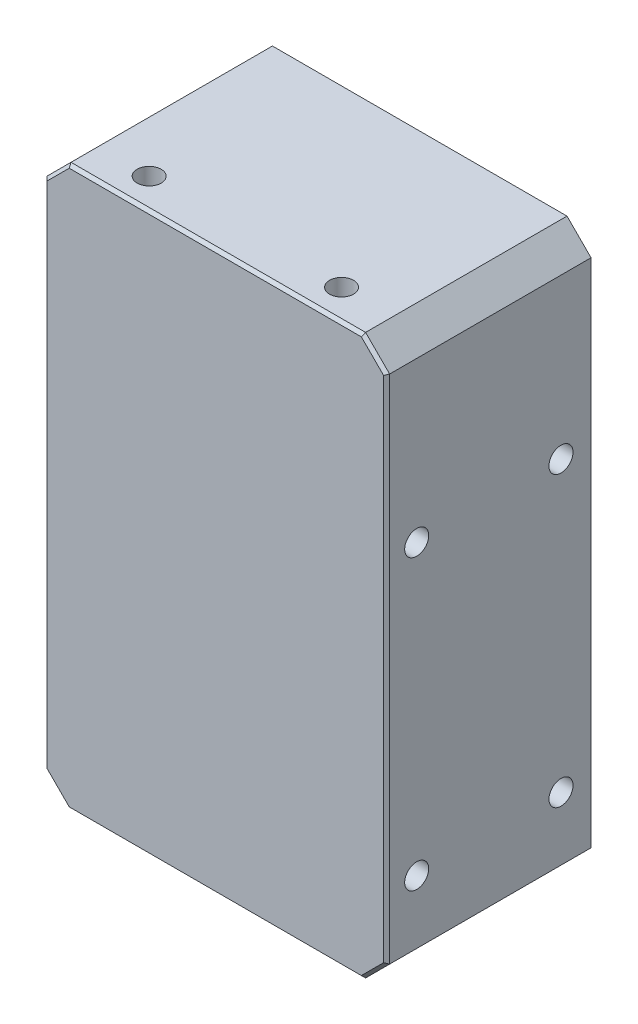
ISO-10303-21;
HEADER;
FILE_DESCRIPTION(('STEP AP214'),'2;1');
FILE_NAME('part.step','',(''),(''),'','','');
FILE_SCHEMA(('AUTOMOTIVE_DESIGN { 1 0 10303 214 1 1 1 1 }'));
ENDSEC;
DATA;
#1=APPLICATION_CONTEXT('core data for automotive mechanical design processes');
#2=APPLICATION_PROTOCOL_DEFINITION('international standard','automotive_design',2000,#1);
#3=PRODUCT_CONTEXT('',#1,'mechanical');
#4=PRODUCT('Part','Part','',(#3));
#5=PRODUCT_RELATED_PRODUCT_CATEGORY('part','',(#4));
#6=PRODUCT_DEFINITION_FORMATION('','',#4);
#7=PRODUCT_DEFINITION_CONTEXT('part definition',#1,'design');
#8=PRODUCT_DEFINITION('design','',#6,#7);
#9=PRODUCT_DEFINITION_SHAPE('','',#8);
#10=(LENGTH_UNIT() NAMED_UNIT(*) SI_UNIT(.MILLI.,.METRE.));
#11=(NAMED_UNIT(*) PLANE_ANGLE_UNIT() SI_UNIT($,.RADIAN.));
#12=(NAMED_UNIT(*) SI_UNIT($,.STERADIAN.) SOLID_ANGLE_UNIT());
#13=UNCERTAINTY_MEASURE_WITH_UNIT(LENGTH_MEASURE(1.E-05),#10,'distance_accuracy_value','');
#14=(GEOMETRIC_REPRESENTATION_CONTEXT(3) GLOBAL_UNCERTAINTY_ASSIGNED_CONTEXT((#13)) GLOBAL_UNIT_ASSIGNED_CONTEXT((#10,
#11,#12)) REPRESENTATION_CONTEXT('',''));
#15=CARTESIAN_POINT('',(0.,0.,0.));
#16=DIRECTION('',(0.,0.,1.));
#17=DIRECTION('',(1.,0.,0.));
#18=AXIS2_PLACEMENT_3D('',#15,#16,#17);
#19=CARTESIAN_POINT('',(-14.25,23.25,-8.5));
#20=DIRECTION('',(1.,0.,0.));
#21=DIRECTION('',(0.,0.,-1.));
#22=AXIS2_PLACEMENT_3D('',#19,#20,#21);
#23=PLANE('',#22);
#24=CARTESIAN_POINT('',(-14.25,-16.,6.));
#25=DIRECTION('',(1.,0.,0.));
#26=DIRECTION('',(0.,0.,-1.));
#27=AXIS2_PLACEMENT_3D('',#24,#25,#26);
#28=CIRCLE('',#27,1.);
#29=CARTESIAN_POINT('',(-14.25,-16.,5.));
#30=VERTEX_POINT('',#29);
#31=EDGE_CURVE('E311',#30,#30,#28,.T.);
#32=ORIENTED_EDGE('',*,*,#31,.T.);
#33=EDGE_LOOP('',(#32));
#34=FACE_BOUND('',#33,.T.);
#35=CARTESIAN_POINT('',(-14.25,8.,6.));
#36=DIRECTION('',(1.,0.,0.));
#37=DIRECTION('',(0.,0.,-1.));
#38=AXIS2_PLACEMENT_3D('',#35,#36,#37);
#39=CIRCLE('',#38,1.);
#40=CARTESIAN_POINT('',(-14.25,8.,5.));
#41=VERTEX_POINT('',#40);
#42=EDGE_CURVE('E327',#41,#41,#39,.T.);
#43=ORIENTED_EDGE('',*,*,#42,.T.);
#44=EDGE_LOOP('',(#43));
#45=FACE_BOUND('',#44,.T.);
#46=DIRECTION('',(0.,0.,1.));
#47=VECTOR('',#46,1.);
#48=CARTESIAN_POINT('',(-14.25,-21.25,8.5));
#49=LINE('',#48,#47);
#50=CARTESIAN_POINT('',(-14.25,-21.25,-8.5));
#51=VERTEX_POINT('',#50);
#52=CARTESIAN_POINT('',(-14.25,-21.25,8.25));
#53=VERTEX_POINT('',#52);
#54=EDGE_CURVE('E192',#51,#53,#49,.T.);
#55=ORIENTED_EDGE('',*,*,#54,.T.);
#56=DIRECTION('',(0.,1.,0.));
#57=VECTOR('',#56,1.);
#58=CARTESIAN_POINT('',(-14.25,23.25,8.25));
#59=LINE('',#58,#57);
#60=CARTESIAN_POINT('',(-14.25,21.25,8.25));
#61=VERTEX_POINT('',#60);
#62=EDGE_CURVE('E236',#53,#61,#59,.T.);
#63=ORIENTED_EDGE('',*,*,#62,.T.);
#64=DIRECTION('',(0.,0.,-1.));
#65=VECTOR('',#64,1.);
#66=CARTESIAN_POINT('',(-14.25,21.25,-8.5));
#67=LINE('',#66,#65);
#68=CARTESIAN_POINT('',(-14.25,21.25,-8.5));
#69=VERTEX_POINT('',#68);
#70=EDGE_CURVE('E189',#61,#69,#67,.T.);
#71=ORIENTED_EDGE('',*,*,#70,.T.);
#72=DIRECTION('',(0.,-1.,0.));
#73=VECTOR('',#72,1.);
#74=CARTESIAN_POINT('',(-14.25,23.25,-8.5));
#75=LINE('',#74,#73);
#76=EDGE_CURVE('E162',#69,#51,#75,.T.);
#77=ORIENTED_EDGE('',*,*,#76,.T.);
#78=EDGE_LOOP('',(#55,#63,#71,#77));
#79=FACE_BOUND('',#78,.T.);
#80=CARTESIAN_POINT('',(-14.25,8.,-6.));
#81=DIRECTION('',(1.,0.,0.));
#82=DIRECTION('',(0.,0.,-1.));
#83=AXIS2_PLACEMENT_3D('',#80,#81,#82);
#84=CIRCLE('',#83,1.);
#85=CARTESIAN_POINT('',(-14.25,8.,-7.));
#86=VERTEX_POINT('',#85);
#87=EDGE_CURVE('E319',#86,#86,#84,.T.);
#88=ORIENTED_EDGE('',*,*,#87,.T.);
#89=EDGE_LOOP('',(#88));
#90=FACE_BOUND('',#89,.T.);
#91=CARTESIAN_POINT('',(-14.25,-16.,-6.));
#92=DIRECTION('',(1.,0.,0.));
#93=DIRECTION('',(0.,0.,-1.));
#94=AXIS2_PLACEMENT_3D('',#91,#92,#93);
#95=CIRCLE('',#94,1.);
#96=CARTESIAN_POINT('',(-14.25,-16.,-7.));
#97=VERTEX_POINT('',#96);
#98=EDGE_CURVE('E303',#97,#97,#95,.T.);
#99=ORIENTED_EDGE('',*,*,#98,.T.);
#100=EDGE_LOOP('',(#99));
#101=FACE_BOUND('',#100,.T.);
#102=ADVANCED_FACE('F16',(#34,#45,#79,#90,#101),#23,.F.);
#103=CARTESIAN_POINT('',(14.25,23.25,8.5));
#104=DIRECTION('',(0.,0.,-1.));
#105=DIRECTION('',(-1.,0.,0.));
#106=AXIS2_PLACEMENT_3D('',#103,#104,#105);
#107=PLANE('',#106);
#108=DIRECTION('',(0.,1.,0.));
#109=VECTOR('',#108,1.);
#110=CARTESIAN_POINT('',(14.,23.25,8.5));
#111=LINE('',#110,#109);
#112=CARTESIAN_POINT('',(14.,-21.1464466094068,8.5));
#113=VERTEX_POINT('',#112);
#114=CARTESIAN_POINT('',(14.,21.1464466094067,8.5));
#115=VERTEX_POINT('',#114);
#116=EDGE_CURVE('E209',#113,#115,#111,.T.);
#117=ORIENTED_EDGE('',*,*,#116,.T.);
#118=DIRECTION('',(-0.707106781186546,0.707106781186549,0.));
#119=VECTOR('',#118,1.);
#120=CARTESIAN_POINT('',(12.0732233047034,23.0732233047034,8.5));
#121=LINE('',#120,#119);
#122=CARTESIAN_POINT('',(12.1464466094067,23.,8.5));
#123=VERTEX_POINT('',#122);
#124=EDGE_CURVE('E224',#115,#123,#121,.T.);
#125=ORIENTED_EDGE('',*,*,#124,.T.);
#126=DIRECTION('',(-1.,0.,0.));
#127=VECTOR('',#126,1.);
#128=CARTESIAN_POINT('',(14.25,23.,8.5));
#129=LINE('',#128,#127);
#130=CARTESIAN_POINT('',(-12.1464466094067,23.,8.5));
#131=VERTEX_POINT('',#130);
#132=EDGE_CURVE('E221',#123,#131,#129,.T.);
#133=ORIENTED_EDGE('',*,*,#132,.T.);
#134=DIRECTION('',(-0.707106781186546,-0.707106781186549,0.));
#135=VECTOR('',#134,1.);
#136=CARTESIAN_POINT('',(-14.0732233047034,21.0732233047033,8.5));
#137=LINE('',#136,#135);
#138=CARTESIAN_POINT('',(-14.,21.1464466094067,8.5));
#139=VERTEX_POINT('',#138);
#140=EDGE_CURVE('E218',#131,#139,#137,.T.);
#141=ORIENTED_EDGE('',*,*,#140,.T.);
#142=DIRECTION('',(0.,-1.,0.));
#143=VECTOR('',#142,1.);
#144=CARTESIAN_POINT('',(-14.,23.25,8.5));
#145=LINE('',#144,#143);
#146=CARTESIAN_POINT('',(-14.,-21.1464466094067,8.5));
#147=VERTEX_POINT('',#146);
#148=EDGE_CURVE('E215',#139,#147,#145,.T.);
#149=ORIENTED_EDGE('',*,*,#148,.T.);
#150=DIRECTION('',(0.707106781186549,-0.707106781186547,0.));
#151=VECTOR('',#150,1.);
#152=CARTESIAN_POINT('',(-12.0732233047034,-23.0732233047034,8.5));
#153=LINE('',#152,#151);
#154=CARTESIAN_POINT('',(-12.1464466094067,-23.,8.5));
#155=VERTEX_POINT('',#154);
#156=EDGE_CURVE('E212',#147,#155,#153,.T.);
#157=ORIENTED_EDGE('',*,*,#156,.T.);
#158=DIRECTION('',(1.,0.,0.));
#159=VECTOR('',#158,1.);
#160=CARTESIAN_POINT('',(12.25,-23.,8.5));
#161=LINE('',#160,#159);
#162=CARTESIAN_POINT('',(12.1464466094067,-23.,8.5));
#163=VERTEX_POINT('',#162);
#164=EDGE_CURVE('E203',#155,#163,#161,.T.);
#165=ORIENTED_EDGE('',*,*,#164,.T.);
#166=DIRECTION('',(0.707106781186548,0.707106781186547,0.));
#167=VECTOR('',#166,1.);
#168=CARTESIAN_POINT('',(14.0732233047034,-21.0732233047034,8.5));
#169=LINE('',#168,#167);
#170=EDGE_CURVE('E206',#163,#113,#169,.T.);
#171=ORIENTED_EDGE('',*,*,#170,.T.);
#172=EDGE_LOOP('',(#117,#125,#133,#141,#149,#157,#165,#171));
#173=FACE_BOUND('',#172,.T.);
#174=ADVANCED_FACE('F428',(#173),#107,.F.);
#175=CARTESIAN_POINT('',(14.25,23.25,-8.5));
#176=DIRECTION('',(-1.,0.,0.));
#177=DIRECTION('',(0.,0.,1.));
#178=AXIS2_PLACEMENT_3D('',#175,#176,#177);
#179=PLANE('',#178);
#180=CARTESIAN_POINT('',(14.25,-16.,-6.));
#181=DIRECTION('',(1.,0.,0.));
#182=DIRECTION('',(0.,0.,-1.));
#183=AXIS2_PLACEMENT_3D('',#180,#181,#182);
#184=CIRCLE('',#183,1.);
#185=CARTESIAN_POINT('',(14.25,-16.,-7.));
#186=VERTEX_POINT('',#185);
#187=EDGE_CURVE('E335',#186,#186,#184,.T.);
#188=ORIENTED_EDGE('',*,*,#187,.F.);
#189=EDGE_LOOP('',(#188));
#190=FACE_BOUND('',#189,.T.);
#191=CARTESIAN_POINT('',(14.25,-16.,6.));
#192=DIRECTION('',(1.,0.,0.));
#193=DIRECTION('',(0.,0.,-1.));
#194=AXIS2_PLACEMENT_3D('',#191,#192,#193);
#195=CIRCLE('',#194,1.);
#196=CARTESIAN_POINT('',(14.25,-16.,5.));
#197=VERTEX_POINT('',#196);
#198=EDGE_CURVE('E343',#197,#197,#195,.T.);
#199=ORIENTED_EDGE('',*,*,#198,.F.);
#200=EDGE_LOOP('',(#199));
#201=FACE_BOUND('',#200,.T.);
#202=CARTESIAN_POINT('',(14.25,8.,-6.));
#203=DIRECTION('',(1.,0.,0.));
#204=DIRECTION('',(0.,0.,-1.));
#205=AXIS2_PLACEMENT_3D('',#202,#203,#204);
#206=CIRCLE('',#205,1.);
#207=CARTESIAN_POINT('',(14.25,8.,-7.));
#208=VERTEX_POINT('',#207);
#209=EDGE_CURVE('E351',#208,#208,#206,.T.);
#210=ORIENTED_EDGE('',*,*,#209,.F.);
#211=EDGE_LOOP('',(#210));
#212=FACE_BOUND('',#211,.T.);
#213=CARTESIAN_POINT('',(14.25,8.,6.));
#214=DIRECTION('',(1.,0.,0.));
#215=DIRECTION('',(0.,0.,-1.));
#216=AXIS2_PLACEMENT_3D('',#213,#214,#215);
#217=CIRCLE('',#216,1.);
#218=CARTESIAN_POINT('',(14.25,8.,5.));
#219=VERTEX_POINT('',#218);
#220=EDGE_CURVE('E359',#219,#219,#217,.T.);
#221=ORIENTED_EDGE('',*,*,#220,.F.);
#222=EDGE_LOOP('',(#221));
#223=FACE_BOUND('',#222,.T.);
#224=DIRECTION('',(0.,0.,1.));
#225=VECTOR('',#224,1.);
#226=CARTESIAN_POINT('',(14.25,21.25,-8.5));
#227=LINE('',#226,#225);
#228=CARTESIAN_POINT('',(14.25,21.25,-8.5));
#229=VERTEX_POINT('',#228);
#230=CARTESIAN_POINT('',(14.25,21.25,8.25));
#231=VERTEX_POINT('',#230);
#232=EDGE_CURVE('E160',#229,#231,#227,.T.);
#233=ORIENTED_EDGE('',*,*,#232,.T.);
#234=DIRECTION('',(0.,-1.,0.));
#235=VECTOR('',#234,1.);
#236=CARTESIAN_POINT('',(14.25,23.25,8.25));
#237=LINE('',#236,#235);
#238=CARTESIAN_POINT('',(14.25,-21.25,8.25));
#239=VERTEX_POINT('',#238);
#240=EDGE_CURVE('E52',#231,#239,#237,.T.);
#241=ORIENTED_EDGE('',*,*,#240,.T.);
#242=DIRECTION('',(0.,0.,-1.));
#243=VECTOR('',#242,1.);
#244=CARTESIAN_POINT('',(14.25,-21.25,-8.5));
#245=LINE('',#244,#243);
#246=CARTESIAN_POINT('',(14.25,-21.25,-8.5));
#247=VERTEX_POINT('',#246);
#248=EDGE_CURVE('E157',#239,#247,#245,.T.);
#249=ORIENTED_EDGE('',*,*,#248,.T.);
#250=DIRECTION('',(0.,-1.,0.));
#251=VECTOR('',#250,1.);
#252=CARTESIAN_POINT('',(14.25,23.25,-8.5));
#253=LINE('',#252,#251);
#254=EDGE_CURVE('E149',#229,#247,#253,.T.);
#255=ORIENTED_EDGE('',*,*,#254,.F.);
#256=EDGE_LOOP('',(#233,#241,#249,#255));
#257=FACE_BOUND('',#256,.T.);
#258=ADVANCED_FACE('F159',(#190,#201,#212,#223,#257),#179,.F.);
#259=CARTESIAN_POINT('',(14.25,23.25,-8.5));
#260=DIRECTION('',(0.,0.,1.));
#261=DIRECTION('',(1.,0.,0.));
#262=AXIS2_PLACEMENT_3D('',#259,#260,#261);
#263=PLANE('',#262);
#264=ORIENTED_EDGE('',*,*,#254,.T.);
#265=DIRECTION('',(-0.707106781186548,-0.707106781186547,0.));
#266=VECTOR('',#265,1.);
#267=CARTESIAN_POINT('',(14.25,-21.25,-8.5));
#268=LINE('',#267,#266);
#269=CARTESIAN_POINT('',(12.25,-23.25,-8.5));
#270=VERTEX_POINT('',#269);
#271=EDGE_CURVE('E180',#247,#270,#268,.T.);
#272=ORIENTED_EDGE('',*,*,#271,.T.);
#273=DIRECTION('',(-1.,0.,0.));
#274=VECTOR('',#273,1.);
#275=CARTESIAN_POINT('',(14.25,-23.25,-8.5));
#276=LINE('',#275,#274);
#277=CARTESIAN_POINT('',(-12.25,-23.25,-8.5));
#278=VERTEX_POINT('',#277);
#279=EDGE_CURVE('E383',#270,#278,#276,.T.);
#280=ORIENTED_EDGE('',*,*,#279,.T.);
#281=DIRECTION('',(-0.707106781186549,0.707106781186547,0.));
#282=VECTOR('',#281,1.);
#283=CARTESIAN_POINT('',(-14.25,-21.25,-8.5));
#284=LINE('',#283,#282);
#285=EDGE_CURVE('E177',#278,#51,#284,.T.);
#286=ORIENTED_EDGE('',*,*,#285,.T.);
#287=ORIENTED_EDGE('',*,*,#76,.F.);
#288=DIRECTION('',(-0.707106781186546,-0.707106781186549,0.));
#289=VECTOR('',#288,1.);
#290=CARTESIAN_POINT('',(-12.25,23.25,-8.5));
#291=LINE('',#290,#289);
#292=CARTESIAN_POINT('',(-12.25,23.25,-8.5));
#293=VERTEX_POINT('',#292);
#294=EDGE_CURVE('E156',#69,#293,#291,.F.);
#295=ORIENTED_EDGE('',*,*,#294,.T.);
#296=DIRECTION('',(-1.,0.,0.));
#297=VECTOR('',#296,1.);
#298=CARTESIAN_POINT('',(14.25,23.25,-8.5));
#299=LINE('',#298,#297);
#300=CARTESIAN_POINT('',(12.25,23.25,-8.5));
#301=VERTEX_POINT('',#300);
#302=EDGE_CURVE('E151',#301,#293,#299,.T.);
#303=ORIENTED_EDGE('',*,*,#302,.F.);
#304=DIRECTION('',(-0.707106781186546,0.707106781186549,0.));
#305=VECTOR('',#304,1.);
#306=CARTESIAN_POINT('',(12.25,23.25,-8.5));
#307=LINE('',#306,#305);
#308=EDGE_CURVE('E146',#301,#229,#307,.F.);
#309=ORIENTED_EDGE('',*,*,#308,.T.);
#310=EDGE_LOOP('',(#264,#272,#280,#286,#287,#295,#303,#309));
#311=FACE_BOUND('',#310,.T.);
#312=ADVANCED_FACE('F148',(#311),#263,.F.);
#313=CARTESIAN_POINT('',(-14.25,23.25,8.5));
#314=DIRECTION('',(0.,-1.,0.));
#315=DIRECTION('',(0.,0.,-1.));
#316=AXIS2_PLACEMENT_3D('',#313,#314,#315);
#317=PLANE('',#316);
#318=CARTESIAN_POINT('',(-8.,23.25,6.));
#319=DIRECTION('',(0.,1.,0.));
#320=DIRECTION('',(0.,0.,1.));
#321=AXIS2_PLACEMENT_3D('',#318,#319,#320);
#322=CIRCLE('',#321,1.);
#323=CARTESIAN_POINT('',(-8.,23.25,7.));
#324=VERTEX_POINT('',#323);
#325=EDGE_CURVE('E367',#324,#324,#322,.T.);
#326=ORIENTED_EDGE('',*,*,#325,.F.);
#327=EDGE_LOOP('',(#326));
#328=FACE_BOUND('',#327,.T.);
#329=CARTESIAN_POINT('',(8.,23.25,6.));
#330=DIRECTION('',(0.,1.,0.));
#331=DIRECTION('',(0.,0.,1.));
#332=AXIS2_PLACEMENT_3D('',#329,#330,#331);
#333=CIRCLE('',#332,1.);
#334=CARTESIAN_POINT('',(8.,23.25,7.));
#335=VERTEX_POINT('',#334);
#336=EDGE_CURVE('E375',#335,#335,#333,.T.);
#337=ORIENTED_EDGE('',*,*,#336,.F.);
#338=EDGE_LOOP('',(#337));
#339=FACE_BOUND('',#338,.T.);
#340=DIRECTION('',(0.,0.,1.));
#341=VECTOR('',#340,1.);
#342=CARTESIAN_POINT('',(-12.25,23.25,8.5));
#343=LINE('',#342,#341);
#344=CARTESIAN_POINT('',(-12.25,23.25,8.25));
#345=VERTEX_POINT('',#344);
#346=EDGE_CURVE('E199',#293,#345,#343,.T.);
#347=ORIENTED_EDGE('',*,*,#346,.T.);
#348=DIRECTION('',(1.,0.,0.));
#349=VECTOR('',#348,1.);
#350=CARTESIAN_POINT('',(-14.25,23.25,8.25));
#351=LINE('',#350,#349);
#352=CARTESIAN_POINT('',(12.25,23.25,8.25));
#353=VERTEX_POINT('',#352);
#354=EDGE_CURVE('E230',#345,#353,#351,.T.);
#355=ORIENTED_EDGE('',*,*,#354,.T.);
#356=DIRECTION('',(0.,0.,-1.));
#357=VECTOR('',#356,1.);
#358=CARTESIAN_POINT('',(12.25,23.25,8.5));
#359=LINE('',#358,#357);
#360=EDGE_CURVE('E196',#353,#301,#359,.T.);
#361=ORIENTED_EDGE('',*,*,#360,.T.);
#362=ORIENTED_EDGE('',*,*,#302,.T.);
#363=EDGE_LOOP('',(#347,#355,#361,#362));
#364=FACE_BOUND('',#363,.T.);
#365=ADVANCED_FACE('F415',(#328,#339,#364),#317,.F.);
#366=CARTESIAN_POINT('',(-14.25,-23.25,8.5));
#367=DIRECTION('',(0.,-1.,0.));
#368=DIRECTION('',(0.,0.,-1.));
#369=AXIS2_PLACEMENT_3D('',#366,#367,#368);
#370=PLANE('',#369);
#371=CARTESIAN_POINT('',(8.,-23.25,-6.));
#372=DIRECTION('',(0.,-1.,0.));
#373=DIRECTION('',(0.,0.,-1.));
#374=AXIS2_PLACEMENT_3D('',#371,#372,#373);
#375=CIRCLE('',#374,1.);
#376=CARTESIAN_POINT('',(8.,-23.25,-7.));
#377=VERTEX_POINT('',#376);
#378=EDGE_CURVE('E585',#377,#377,#375,.T.);
#379=ORIENTED_EDGE('',*,*,#378,.F.);
#380=EDGE_LOOP('',(#379));
#381=FACE_BOUND('',#380,.T.);
#382=CARTESIAN_POINT('',(-8.,-23.25,-6.));
#383=DIRECTION('',(0.,-1.,0.));
#384=DIRECTION('',(0.,0.,-1.));
#385=AXIS2_PLACEMENT_3D('',#382,#383,#384);
#386=CIRCLE('',#385,1.);
#387=CARTESIAN_POINT('',(-8.,-23.25,-7.));
#388=VERTEX_POINT('',#387);
#389=EDGE_CURVE('E596',#388,#388,#386,.T.);
#390=ORIENTED_EDGE('',*,*,#389,.F.);
#391=EDGE_LOOP('',(#390));
#392=FACE_BOUND('',#391,.T.);
#393=CARTESIAN_POINT('',(-8.,-23.25,6.));
#394=DIRECTION('',(0.,-1.,0.));
#395=DIRECTION('',(0.,0.,-1.));
#396=AXIS2_PLACEMENT_3D('',#393,#394,#395);
#397=CIRCLE('',#396,1.);
#398=CARTESIAN_POINT('',(-8.,-23.25,5.));
#399=VERTEX_POINT('',#398);
#400=EDGE_CURVE('E276',#399,#399,#397,.T.);
#401=ORIENTED_EDGE('',*,*,#400,.F.);
#402=EDGE_LOOP('',(#401));
#403=FACE_BOUND('',#402,.T.);
#404=CARTESIAN_POINT('',(8.,-23.25,6.));
#405=DIRECTION('',(0.,-1.,0.));
#406=DIRECTION('',(0.,0.,-1.));
#407=AXIS2_PLACEMENT_3D('',#404,#405,#406);
#408=CIRCLE('',#407,1.);
#409=CARTESIAN_POINT('',(8.,-23.25,5.));
#410=VERTEX_POINT('',#409);
#411=EDGE_CURVE('E295',#410,#410,#408,.T.);
#412=ORIENTED_EDGE('',*,*,#411,.F.);
#413=EDGE_LOOP('',(#412));
#414=FACE_BOUND('',#413,.T.);
#415=DIRECTION('',(0.,0.,1.));
#416=VECTOR('',#415,1.);
#417=CARTESIAN_POINT('',(12.25,-23.25,8.5));
#418=LINE('',#417,#416);
#419=CARTESIAN_POINT('',(12.25,-23.25,8.25));
#420=VERTEX_POINT('',#419);
#421=EDGE_CURVE('E186',#270,#420,#418,.T.);
#422=ORIENTED_EDGE('',*,*,#421,.T.);
#423=DIRECTION('',(-1.,0.,0.));
#424=VECTOR('',#423,1.);
#425=CARTESIAN_POINT('',(-12.25,-23.25,8.25));
#426=LINE('',#425,#424);
#427=CARTESIAN_POINT('',(-12.25,-23.25,8.25));
#428=VERTEX_POINT('',#427);
#429=EDGE_CURVE('E11',#420,#428,#426,.T.);
#430=ORIENTED_EDGE('',*,*,#429,.T.);
#431=DIRECTION('',(0.,0.,-1.));
#432=VECTOR('',#431,1.);
#433=CARTESIAN_POINT('',(-12.25,-23.25,-8.5));
#434=LINE('',#433,#432);
#435=EDGE_CURVE('E183',#428,#278,#434,.T.);
#436=ORIENTED_EDGE('',*,*,#435,.T.);
#437=ORIENTED_EDGE('',*,*,#279,.F.);
#438=EDGE_LOOP('',(#422,#430,#436,#437));
#439=FACE_BOUND('',#438,.T.);
#440=ADVANCED_FACE('F439',(#381,#392,#403,#414,#439),#370,.T.);
#441=CARTESIAN_POINT('',(8.,20.25,6.));
#442=DIRECTION('',(0.,1.,0.));
#443=DIRECTION('',(0.,0.,1.));
#444=AXIS2_PLACEMENT_3D('',#441,#442,#443);
#445=CYLINDRICAL_SURFACE('',#444,1.);
#446=CARTESIAN_POINT('',(8.,20.25,6.));
#447=DIRECTION('',(0.,1.,0.));
#448=DIRECTION('',(0.,0.,1.));
#449=AXIS2_PLACEMENT_3D('',#446,#447,#448);
#450=CIRCLE('',#449,1.);
#451=CARTESIAN_POINT('',(8.,20.25,7.));
#452=VERTEX_POINT('',#451);
#453=EDGE_CURVE('E379',#452,#452,#450,.T.);
#454=ORIENTED_EDGE('',*,*,#453,.F.);
#455=EDGE_LOOP('',(#454));
#456=FACE_BOUND('',#455,.T.);
#457=ORIENTED_EDGE('',*,*,#336,.T.);
#458=EDGE_LOOP('',(#457));
#459=FACE_BOUND('',#458,.T.);
#460=ADVANCED_FACE('F470',(#456,#459),#445,.F.);
#461=CARTESIAN_POINT('',(8.,20.25,6.));
#462=DIRECTION('',(0.,1.,0.));
#463=DIRECTION('',(0.,0.,1.));
#464=AXIS2_PLACEMENT_3D('',#461,#462,#463);
#465=PLANE('',#464);
#466=ORIENTED_EDGE('',*,*,#453,.T.);
#467=EDGE_LOOP('',(#466));
#468=FACE_BOUND('',#467,.T.);
#469=ADVANCED_FACE('F477',(#468),#465,.T.);
#470=CARTESIAN_POINT('',(-8.,20.25,6.));
#471=DIRECTION('',(0.,1.,0.));
#472=DIRECTION('',(0.,0.,1.));
#473=AXIS2_PLACEMENT_3D('',#470,#471,#472);
#474=CYLINDRICAL_SURFACE('',#473,1.);
#475=CARTESIAN_POINT('',(-8.,20.25,6.));
#476=DIRECTION('',(0.,1.,0.));
#477=DIRECTION('',(0.,0.,1.));
#478=AXIS2_PLACEMENT_3D('',#475,#476,#477);
#479=CIRCLE('',#478,1.);
#480=CARTESIAN_POINT('',(-8.,20.25,7.));
#481=VERTEX_POINT('',#480);
#482=EDGE_CURVE('E371',#481,#481,#479,.T.);
#483=ORIENTED_EDGE('',*,*,#482,.F.);
#484=EDGE_LOOP('',(#483));
#485=FACE_BOUND('',#484,.T.);
#486=ORIENTED_EDGE('',*,*,#325,.T.);
#487=EDGE_LOOP('',(#486));
#488=FACE_BOUND('',#487,.T.);
#489=ADVANCED_FACE('F481',(#485,#488),#474,.F.);
#490=CARTESIAN_POINT('',(-8.,20.25,6.));
#491=DIRECTION('',(0.,1.,0.));
#492=DIRECTION('',(0.,0.,1.));
#493=AXIS2_PLACEMENT_3D('',#490,#491,#492);
#494=PLANE('',#493);
#495=ORIENTED_EDGE('',*,*,#482,.T.);
#496=EDGE_LOOP('',(#495));
#497=FACE_BOUND('',#496,.T.);
#498=ADVANCED_FACE('F485',(#497),#494,.T.);
#499=CARTESIAN_POINT('',(11.25,8.,6.));
#500=DIRECTION('',(1.,0.,0.));
#501=DIRECTION('',(0.,0.,-1.));
#502=AXIS2_PLACEMENT_3D('',#499,#500,#501);
#503=CYLINDRICAL_SURFACE('',#502,1.);
#504=CARTESIAN_POINT('',(11.25,8.,6.));
#505=DIRECTION('',(1.,0.,0.));
#506=DIRECTION('',(0.,0.,-1.));
#507=AXIS2_PLACEMENT_3D('',#504,#505,#506);
#508=CIRCLE('',#507,1.);
#509=CARTESIAN_POINT('',(11.25,8.,5.));
#510=VERTEX_POINT('',#509);
#511=EDGE_CURVE('E363',#510,#510,#508,.T.);
#512=ORIENTED_EDGE('',*,*,#511,.F.);
#513=EDGE_LOOP('',(#512));
#514=FACE_BOUND('',#513,.T.);
#515=ORIENTED_EDGE('',*,*,#220,.T.);
#516=EDGE_LOOP('',(#515));
#517=FACE_BOUND('',#516,.T.);
#518=ADVANCED_FACE('F489',(#514,#517),#503,.F.);
#519=CARTESIAN_POINT('',(11.25,8.,6.));
#520=DIRECTION('',(1.,0.,0.));
#521=DIRECTION('',(0.,0.,-1.));
#522=AXIS2_PLACEMENT_3D('',#519,#520,#521);
#523=PLANE('',#522);
#524=ORIENTED_EDGE('',*,*,#511,.T.);
#525=EDGE_LOOP('',(#524));
#526=FACE_BOUND('',#525,.T.);
#527=ADVANCED_FACE('F493',(#526),#523,.T.);
#528=CARTESIAN_POINT('',(11.25,8.,-6.));
#529=DIRECTION('',(1.,0.,0.));
#530=DIRECTION('',(0.,0.,-1.));
#531=AXIS2_PLACEMENT_3D('',#528,#529,#530);
#532=CYLINDRICAL_SURFACE('',#531,1.);
#533=CARTESIAN_POINT('',(11.25,8.,-6.));
#534=DIRECTION('',(1.,0.,0.));
#535=DIRECTION('',(0.,0.,-1.));
#536=AXIS2_PLACEMENT_3D('',#533,#534,#535);
#537=CIRCLE('',#536,1.);
#538=CARTESIAN_POINT('',(11.25,8.,-7.));
#539=VERTEX_POINT('',#538);
#540=EDGE_CURVE('E355',#539,#539,#537,.T.);
#541=ORIENTED_EDGE('',*,*,#540,.F.);
#542=EDGE_LOOP('',(#541));
#543=FACE_BOUND('',#542,.T.);
#544=ORIENTED_EDGE('',*,*,#209,.T.);
#545=EDGE_LOOP('',(#544));
#546=FACE_BOUND('',#545,.T.);
#547=ADVANCED_FACE('F497',(#543,#546),#532,.F.);
#548=CARTESIAN_POINT('',(11.25,8.,-6.));
#549=DIRECTION('',(1.,0.,0.));
#550=DIRECTION('',(0.,0.,-1.));
#551=AXIS2_PLACEMENT_3D('',#548,#549,#550);
#552=PLANE('',#551);
#553=ORIENTED_EDGE('',*,*,#540,.T.);
#554=EDGE_LOOP('',(#553));
#555=FACE_BOUND('',#554,.T.);
#556=ADVANCED_FACE('F501',(#555),#552,.T.);
#557=CARTESIAN_POINT('',(11.25,-16.,6.));
#558=DIRECTION('',(1.,0.,0.));
#559=DIRECTION('',(0.,0.,-1.));
#560=AXIS2_PLACEMENT_3D('',#557,#558,#559);
#561=CYLINDRICAL_SURFACE('',#560,1.);
#562=CARTESIAN_POINT('',(11.25,-16.,6.));
#563=DIRECTION('',(1.,0.,0.));
#564=DIRECTION('',(0.,0.,-1.));
#565=AXIS2_PLACEMENT_3D('',#562,#563,#564);
#566=CIRCLE('',#565,1.);
#567=CARTESIAN_POINT('',(11.25,-16.,5.));
#568=VERTEX_POINT('',#567);
#569=EDGE_CURVE('E347',#568,#568,#566,.T.);
#570=ORIENTED_EDGE('',*,*,#569,.F.);
#571=EDGE_LOOP('',(#570));
#572=FACE_BOUND('',#571,.T.);
#573=ORIENTED_EDGE('',*,*,#198,.T.);
#574=EDGE_LOOP('',(#573));
#575=FACE_BOUND('',#574,.T.);
#576=ADVANCED_FACE('F505',(#572,#575),#561,.F.);
#577=CARTESIAN_POINT('',(11.25,-16.,6.));
#578=DIRECTION('',(1.,0.,0.));
#579=DIRECTION('',(0.,0.,-1.));
#580=AXIS2_PLACEMENT_3D('',#577,#578,#579);
#581=PLANE('',#580);
#582=ORIENTED_EDGE('',*,*,#569,.T.);
#583=EDGE_LOOP('',(#582));
#584=FACE_BOUND('',#583,.T.);
#585=ADVANCED_FACE('F509',(#584),#581,.T.);
#586=CARTESIAN_POINT('',(11.25,-16.,-6.));
#587=DIRECTION('',(1.,0.,0.));
#588=DIRECTION('',(0.,0.,-1.));
#589=AXIS2_PLACEMENT_3D('',#586,#587,#588);
#590=CYLINDRICAL_SURFACE('',#589,1.);
#591=CARTESIAN_POINT('',(11.25,-16.,-6.));
#592=DIRECTION('',(1.,0.,0.));
#593=DIRECTION('',(0.,0.,-1.));
#594=AXIS2_PLACEMENT_3D('',#591,#592,#593);
#595=CIRCLE('',#594,1.);
#596=CARTESIAN_POINT('',(11.25,-16.,-7.));
#597=VERTEX_POINT('',#596);
#598=EDGE_CURVE('E339',#597,#597,#595,.T.);
#599=ORIENTED_EDGE('',*,*,#598,.F.);
#600=EDGE_LOOP('',(#599));
#601=FACE_BOUND('',#600,.T.);
#602=ORIENTED_EDGE('',*,*,#187,.T.);
#603=EDGE_LOOP('',(#602));
#604=FACE_BOUND('',#603,.T.);
#605=ADVANCED_FACE('F513',(#601,#604),#590,.F.);
#606=CARTESIAN_POINT('',(11.25,-16.,-6.));
#607=DIRECTION('',(1.,0.,0.));
#608=DIRECTION('',(0.,0.,-1.));
#609=AXIS2_PLACEMENT_3D('',#606,#607,#608);
#610=PLANE('',#609);
#611=ORIENTED_EDGE('',*,*,#598,.T.);
#612=EDGE_LOOP('',(#611));
#613=FACE_BOUND('',#612,.T.);
#614=ADVANCED_FACE('F517',(#613),#610,.T.);
#615=CARTESIAN_POINT('',(-11.25,8.,6.));
#616=DIRECTION('',(-1.,0.,0.));
#617=DIRECTION('',(0.,0.,1.));
#618=AXIS2_PLACEMENT_3D('',#615,#616,#617);
#619=CYLINDRICAL_SURFACE('',#618,1.);
#620=CARTESIAN_POINT('',(-11.25,8.,6.));
#621=DIRECTION('',(1.,0.,0.));
#622=DIRECTION('',(0.,0.,-1.));
#623=AXIS2_PLACEMENT_3D('',#620,#621,#622);
#624=CIRCLE('',#623,1.);
#625=CARTESIAN_POINT('',(-11.25,8.,5.));
#626=VERTEX_POINT('',#625);
#627=EDGE_CURVE('E331',#626,#626,#624,.T.);
#628=ORIENTED_EDGE('',*,*,#627,.T.);
#629=EDGE_LOOP('',(#628));
#630=FACE_BOUND('',#629,.T.);
#631=ORIENTED_EDGE('',*,*,#42,.F.);
#632=EDGE_LOOP('',(#631));
#633=FACE_BOUND('',#632,.T.);
#634=ADVANCED_FACE('F521',(#630,#633),#619,.F.);
#635=CARTESIAN_POINT('',(-11.25,8.,6.));
#636=DIRECTION('',(-1.,0.,0.));
#637=DIRECTION('',(0.,0.,-1.));
#638=AXIS2_PLACEMENT_3D('',#635,#636,#637);
#639=PLANE('',#638);
#640=ORIENTED_EDGE('',*,*,#627,.F.);
#641=EDGE_LOOP('',(#640));
#642=FACE_BOUND('',#641,.T.);
#643=ADVANCED_FACE('F525',(#642),#639,.T.);
#644=CARTESIAN_POINT('',(-11.25,8.,-6.));
#645=DIRECTION('',(-1.,0.,0.));
#646=DIRECTION('',(0.,0.,1.));
#647=AXIS2_PLACEMENT_3D('',#644,#645,#646);
#648=CYLINDRICAL_SURFACE('',#647,1.);
#649=CARTESIAN_POINT('',(-11.25,8.,-6.));
#650=DIRECTION('',(1.,0.,0.));
#651=DIRECTION('',(0.,0.,-1.));
#652=AXIS2_PLACEMENT_3D('',#649,#650,#651);
#653=CIRCLE('',#652,1.);
#654=CARTESIAN_POINT('',(-11.25,8.,-7.));
#655=VERTEX_POINT('',#654);
#656=EDGE_CURVE('E323',#655,#655,#653,.T.);
#657=ORIENTED_EDGE('',*,*,#656,.T.);
#658=EDGE_LOOP('',(#657));
#659=FACE_BOUND('',#658,.T.);
#660=ORIENTED_EDGE('',*,*,#87,.F.);
#661=EDGE_LOOP('',(#660));
#662=FACE_BOUND('',#661,.T.);
#663=ADVANCED_FACE('F529',(#659,#662),#648,.F.);
#664=CARTESIAN_POINT('',(-11.25,8.,-6.));
#665=DIRECTION('',(-1.,0.,0.));
#666=DIRECTION('',(0.,0.,-1.));
#667=AXIS2_PLACEMENT_3D('',#664,#665,#666);
#668=PLANE('',#667);
#669=ORIENTED_EDGE('',*,*,#656,.F.);
#670=EDGE_LOOP('',(#669));
#671=FACE_BOUND('',#670,.T.);
#672=ADVANCED_FACE('F533',(#671),#668,.T.);
#673=CARTESIAN_POINT('',(-11.25,-16.,6.));
#674=DIRECTION('',(-1.,0.,0.));
#675=DIRECTION('',(0.,0.,1.));
#676=AXIS2_PLACEMENT_3D('',#673,#674,#675);
#677=CYLINDRICAL_SURFACE('',#676,1.);
#678=CARTESIAN_POINT('',(-11.25,-16.,6.));
#679=DIRECTION('',(1.,0.,0.));
#680=DIRECTION('',(0.,0.,-1.));
#681=AXIS2_PLACEMENT_3D('',#678,#679,#680);
#682=CIRCLE('',#681,1.);
#683=CARTESIAN_POINT('',(-11.25,-16.,5.));
#684=VERTEX_POINT('',#683);
#685=EDGE_CURVE('E315',#684,#684,#682,.T.);
#686=ORIENTED_EDGE('',*,*,#685,.T.);
#687=EDGE_LOOP('',(#686));
#688=FACE_BOUND('',#687,.T.);
#689=ORIENTED_EDGE('',*,*,#31,.F.);
#690=EDGE_LOOP('',(#689));
#691=FACE_BOUND('',#690,.T.);
#692=ADVANCED_FACE('F537',(#688,#691),#677,.F.);
#693=CARTESIAN_POINT('',(-11.25,-16.,6.));
#694=DIRECTION('',(-1.,0.,0.));
#695=DIRECTION('',(0.,0.,-1.));
#696=AXIS2_PLACEMENT_3D('',#693,#694,#695);
#697=PLANE('',#696);
#698=ORIENTED_EDGE('',*,*,#685,.F.);
#699=EDGE_LOOP('',(#698));
#700=FACE_BOUND('',#699,.T.);
#701=ADVANCED_FACE('F541',(#700),#697,.T.);
#702=CARTESIAN_POINT('',(-11.25,-16.,-6.));
#703=DIRECTION('',(-1.,0.,0.));
#704=DIRECTION('',(0.,0.,1.));
#705=AXIS2_PLACEMENT_3D('',#702,#703,#704);
#706=CYLINDRICAL_SURFACE('',#705,1.);
#707=CARTESIAN_POINT('',(-11.25,-16.,-6.));
#708=DIRECTION('',(1.,0.,0.));
#709=DIRECTION('',(0.,0.,-1.));
#710=AXIS2_PLACEMENT_3D('',#707,#708,#709);
#711=CIRCLE('',#710,1.);
#712=CARTESIAN_POINT('',(-11.25,-16.,-7.));
#713=VERTEX_POINT('',#712);
#714=EDGE_CURVE('E307',#713,#713,#711,.T.);
#715=ORIENTED_EDGE('',*,*,#714,.T.);
#716=EDGE_LOOP('',(#715));
#717=FACE_BOUND('',#716,.T.);
#718=ORIENTED_EDGE('',*,*,#98,.F.);
#719=EDGE_LOOP('',(#718));
#720=FACE_BOUND('',#719,.T.);
#721=ADVANCED_FACE('F545',(#717,#720),#706,.F.);
#722=CARTESIAN_POINT('',(-11.25,-16.,-6.));
#723=DIRECTION('',(-1.,0.,0.));
#724=DIRECTION('',(0.,0.,-1.));
#725=AXIS2_PLACEMENT_3D('',#722,#723,#724);
#726=PLANE('',#725);
#727=ORIENTED_EDGE('',*,*,#714,.F.);
#728=EDGE_LOOP('',(#727));
#729=FACE_BOUND('',#728,.T.);
#730=ADVANCED_FACE('F549',(#729),#726,.T.);
#731=CARTESIAN_POINT('',(8.,-20.25,6.));
#732=DIRECTION('',(0.,-1.,0.));
#733=DIRECTION('',(0.,0.,-1.));
#734=AXIS2_PLACEMENT_3D('',#731,#732,#733);
#735=CYLINDRICAL_SURFACE('',#734,1.);
#736=CARTESIAN_POINT('',(8.,-20.25,6.));
#737=DIRECTION('',(0.,-1.,0.));
#738=DIRECTION('',(0.,0.,-1.));
#739=AXIS2_PLACEMENT_3D('',#736,#737,#738);
#740=CIRCLE('',#739,1.);
#741=CARTESIAN_POINT('',(8.,-20.25,5.));
#742=VERTEX_POINT('',#741);
#743=EDGE_CURVE('E299',#742,#742,#740,.T.);
#744=ORIENTED_EDGE('',*,*,#743,.F.);
#745=EDGE_LOOP('',(#744));
#746=FACE_BOUND('',#745,.T.);
#747=ORIENTED_EDGE('',*,*,#411,.T.);
#748=EDGE_LOOP('',(#747));
#749=FACE_BOUND('',#748,.T.);
#750=ADVANCED_FACE('F553',(#746,#749),#735,.F.);
#751=CARTESIAN_POINT('',(8.,-20.25,6.));
#752=DIRECTION('',(0.,-1.,0.));
#753=DIRECTION('',(0.,0.,-1.));
#754=AXIS2_PLACEMENT_3D('',#751,#752,#753);
#755=PLANE('',#754);
#756=ORIENTED_EDGE('',*,*,#743,.T.);
#757=EDGE_LOOP('',(#756));
#758=FACE_BOUND('',#757,.T.);
#759=ADVANCED_FACE('F557',(#758),#755,.T.);
#760=CARTESIAN_POINT('',(-8.,-20.25,6.));
#761=DIRECTION('',(0.,-1.,0.));
#762=DIRECTION('',(0.,0.,-1.));
#763=AXIS2_PLACEMENT_3D('',#760,#761,#762);
#764=CYLINDRICAL_SURFACE('',#763,1.);
#765=CARTESIAN_POINT('',(-8.,-20.25,6.));
#766=DIRECTION('',(0.,-1.,0.));
#767=DIRECTION('',(0.,0.,-1.));
#768=AXIS2_PLACEMENT_3D('',#765,#766,#767);
#769=CIRCLE('',#768,1.);
#770=CARTESIAN_POINT('',(-8.,-20.25,5.));
#771=VERTEX_POINT('',#770);
#772=EDGE_CURVE('E286',#771,#771,#769,.T.);
#773=ORIENTED_EDGE('',*,*,#772,.F.);
#774=EDGE_LOOP('',(#773));
#775=FACE_BOUND('',#774,.T.);
#776=ORIENTED_EDGE('',*,*,#400,.T.);
#777=EDGE_LOOP('',(#776));
#778=FACE_BOUND('',#777,.T.);
#779=ADVANCED_FACE('F451',(#775,#778),#764,.F.);
#780=CARTESIAN_POINT('',(-8.,-20.25,6.));
#781=DIRECTION('',(0.,-1.,0.));
#782=DIRECTION('',(0.,0.,-1.));
#783=AXIS2_PLACEMENT_3D('',#780,#781,#782);
#784=PLANE('',#783);
#785=ORIENTED_EDGE('',*,*,#772,.T.);
#786=EDGE_LOOP('',(#785));
#787=FACE_BOUND('',#786,.T.);
#788=ADVANCED_FACE('F443',(#787),#784,.T.);
#789=CARTESIAN_POINT('',(14.25,-21.25,-8.5));
#790=DIRECTION('',(0.707106781186547,-0.707106781186548,0.));
#791=DIRECTION('',(0.707106781186548,0.707106781186547,0.));
#792=AXIS2_PLACEMENT_3D('',#789,#790,#791);
#793=PLANE('',#792);
#794=ORIENTED_EDGE('',*,*,#248,.F.);
#795=DIRECTION('',(-0.707106781186548,-0.707106781186547,0.));
#796=VECTOR('',#795,1.);
#797=CARTESIAN_POINT('',(12.25,-23.25,8.25));
#798=LINE('',#797,#796);
#799=EDGE_CURVE('E26',#239,#420,#798,.T.);
#800=ORIENTED_EDGE('',*,*,#799,.T.);
#801=ORIENTED_EDGE('',*,*,#421,.F.);
#802=ORIENTED_EDGE('',*,*,#271,.F.);
#803=EDGE_LOOP('',(#794,#800,#801,#802));
#804=FACE_BOUND('',#803,.T.);
#805=ADVANCED_FACE('F441',(#804),#793,.T.);
#806=CARTESIAN_POINT('',(-14.25,-21.25,-8.5));
#807=DIRECTION('',(-0.707106781186547,-0.707106781186549,0.));
#808=DIRECTION('',(0.707106781186549,-0.707106781186547,0.));
#809=AXIS2_PLACEMENT_3D('',#806,#807,#808);
#810=PLANE('',#809);
#811=ORIENTED_EDGE('',*,*,#435,.F.);
#812=DIRECTION('',(-0.707106781186549,0.707106781186547,0.));
#813=VECTOR('',#812,1.);
#814=CARTESIAN_POINT('',(-14.25,-21.25,8.25));
#815=LINE('',#814,#813);
#816=EDGE_CURVE('E239',#428,#53,#815,.T.);
#817=ORIENTED_EDGE('',*,*,#816,.T.);
#818=ORIENTED_EDGE('',*,*,#54,.F.);
#819=ORIENTED_EDGE('',*,*,#285,.F.);
#820=EDGE_LOOP('',(#811,#817,#818,#819));
#821=FACE_BOUND('',#820,.T.);
#822=ADVANCED_FACE('F404',(#821),#810,.T.);
#823=CARTESIAN_POINT('',(-12.25,23.25,8.5));
#824=DIRECTION('',(0.707106781186549,-0.707106781186546,0.));
#825=DIRECTION('',(0.707106781186546,0.707106781186549,0.));
#826=AXIS2_PLACEMENT_3D('',#823,#824,#825);
#827=PLANE('',#826);
#828=ORIENTED_EDGE('',*,*,#70,.F.);
#829=DIRECTION('',(-0.707106781186546,-0.707106781186549,0.));
#830=VECTOR('',#829,1.);
#831=CARTESIAN_POINT('',(-12.25,23.25,8.25));
#832=LINE('',#831,#830);
#833=EDGE_CURVE('E233',#61,#345,#832,.F.);
#834=ORIENTED_EDGE('',*,*,#833,.T.);
#835=ORIENTED_EDGE('',*,*,#346,.F.);
#836=ORIENTED_EDGE('',*,*,#294,.F.);
#837=EDGE_LOOP('',(#828,#834,#835,#836));
#838=FACE_BOUND('',#837,.T.);
#839=ADVANCED_FACE('F412',(#838),#827,.F.);
#840=CARTESIAN_POINT('',(12.25,23.25,8.5));
#841=DIRECTION('',(-0.707106781186549,-0.707106781186546,0.));
#842=DIRECTION('',(0.707106781186546,-0.707106781186549,0.));
#843=AXIS2_PLACEMENT_3D('',#840,#841,#842);
#844=PLANE('',#843);
#845=ORIENTED_EDGE('',*,*,#360,.F.);
#846=DIRECTION('',(-0.707106781186546,0.707106781186549,0.));
#847=VECTOR('',#846,1.);
#848=CARTESIAN_POINT('',(14.25,21.25,8.25));
#849=LINE('',#848,#847);
#850=EDGE_CURVE('E167',#353,#231,#849,.F.);
#851=ORIENTED_EDGE('',*,*,#850,.T.);
#852=ORIENTED_EDGE('',*,*,#232,.F.);
#853=ORIENTED_EDGE('',*,*,#308,.F.);
#854=EDGE_LOOP('',(#845,#851,#852,#853));
#855=FACE_BOUND('',#854,.T.);
#856=ADVANCED_FACE('F165',(#855),#844,.F.);
#857=CARTESIAN_POINT('',(-22.0732233047033,-13.0732233047034,8.5));
#858=DIRECTION('',(-0.5,-0.5,0.707106781186553));
#859=DIRECTION('',(0.,-0.81649658092773,-0.577350269189621));
#860=AXIS2_PLACEMENT_3D('',#857,#858,#859);
#861=PLANE('',#860);
#862=DIRECTION('',(0.678598344545831,0.281084637714855,0.67859834454585));
#863=VECTOR('',#862,1.);
#864=CARTESIAN_POINT('',(-16.177769290508,-22.0485081852549,6.32223070949192));
#865=LINE('',#864,#863);
#866=EDGE_CURVE('E265',#53,#147,#865,.T.);
#867=ORIENTED_EDGE('',*,*,#866,.F.);
#868=ORIENTED_EDGE('',*,*,#816,.F.);
#869=DIRECTION('',(-0.281084637714833,-0.678598344545845,-0.678598344545845));
#870=VECTOR('',#869,1.);
#871=CARTESIAN_POINT('',(-10.0609010157638,-17.9650475428802,13.5349524571198));
#872=LINE('',#871,#870);
#873=EDGE_CURVE('E20',#155,#428,#872,.T.);
#874=ORIENTED_EDGE('',*,*,#873,.F.);
#875=ORIENTED_EDGE('',*,*,#156,.F.);
#876=EDGE_LOOP('',(#867,#868,#874,#875));
#877=FACE_BOUND('',#876,.T.);
#878=ADVANCED_FACE('F18',(#877),#861,.T.);
#879=CARTESIAN_POINT('',(14.25,-23.,8.5));
#880=DIRECTION('',(0.,-0.707106781186548,0.707106781186548));
#881=DIRECTION('',(0.,-0.707106781186548,-0.707106781186548));
#882=AXIS2_PLACEMENT_3D('',#879,#880,#881);
#883=PLANE('',#882);
#884=ORIENTED_EDGE('',*,*,#873,.T.);
#885=ORIENTED_EDGE('',*,*,#429,.F.);
#886=DIRECTION('',(-0.281084637714811,0.678598344545849,0.678598344545849));
#887=VECTOR('',#886,1.);
#888=CARTESIAN_POINT('',(12.3126453622033,-23.4012392830509,8.0987607169491));
#889=LINE('',#888,#887);
#890=EDGE_CURVE('E262',#163,#420,#889,.F.);
#891=ORIENTED_EDGE('',*,*,#890,.F.);
#892=ORIENTED_EDGE('',*,*,#164,.F.);
#893=EDGE_LOOP('',(#884,#885,#891,#892));
#894=FACE_BOUND('',#893,.T.);
#895=ADVANCED_FACE('F437',(#894),#883,.T.);
#896=CARTESIAN_POINT('',(-14.,23.25,8.5));
#897=DIRECTION('',(0.707106781186557,0.,-0.707106781186538));
#898=DIRECTION('',(-0.707106781186538,0.,-0.707106781186557));
#899=AXIS2_PLACEMENT_3D('',#896,#897,#898);
#900=PLANE('',#899);
#901=ORIENTED_EDGE('',*,*,#866,.T.);
#902=ORIENTED_EDGE('',*,*,#148,.F.);
#903=DIRECTION('',(-0.678598344545832,0.281084637714847,-0.678598344545851));
#904=VECTOR('',#903,1.);
#905=CARTESIAN_POINT('',(-14.4012392830509,21.3126453622033,8.09876071694905));
#906=LINE('',#905,#904);
#907=EDGE_CURVE('E258',#61,#139,#906,.F.);
#908=ORIENTED_EDGE('',*,*,#907,.F.);
#909=ORIENTED_EDGE('',*,*,#62,.F.);
#910=EDGE_LOOP('',(#901,#902,#908,#909));
#911=FACE_BOUND('',#910,.T.);
#912=ADVANCED_FACE('F409',(#911),#900,.F.);
#913=CARTESIAN_POINT('',(36.3232233047034,1.17677669529659,8.5));
#914=DIRECTION('',(0.5,-0.5,0.707106781186544));
#915=DIRECTION('',(0.,-0.816496580927723,-0.57735026918963));
#916=AXIS2_PLACEMENT_3D('',#913,#914,#915);
#917=PLANE('',#916);
#918=ORIENTED_EDGE('',*,*,#890,.T.);
#919=ORIENTED_EDGE('',*,*,#799,.F.);
#920=DIRECTION('',(0.678598344545842,-0.281084637714822,-0.678598344545852));
#921=VECTOR('',#920,1.);
#922=CARTESIAN_POINT('',(20.0217373338132,-23.6407318821206,2.47826266618678));
#923=LINE('',#922,#921);
#924=EDGE_CURVE('E254',#113,#239,#923,.T.);
#925=ORIENTED_EDGE('',*,*,#924,.F.);
#926=ORIENTED_EDGE('',*,*,#170,.F.);
#927=EDGE_LOOP('',(#918,#919,#925,#926));
#928=FACE_BOUND('',#927,.T.);
#929=ADVANCED_FACE('F435',(#928),#917,.T.);
#930=CARTESIAN_POINT('',(1.17677669529658,36.3232233047033,8.5));
#931=DIRECTION('',(0.5,-0.5,-0.70710678118655));
#932=DIRECTION('',(-0.816496580927728,0.,-0.577350269189624));
#933=AXIS2_PLACEMENT_3D('',#930,#931,#932);
#934=PLANE('',#933);
#935=ORIENTED_EDGE('',*,*,#907,.T.);
#936=ORIENTED_EDGE('',*,*,#140,.F.);
#937=DIRECTION('',(-0.281084637714828,0.678598344545846,-0.678598344545846));
#938=VECTOR('',#937,1.);
#939=CARTESIAN_POINT('',(-13.6351169156791,26.5939680433048,4.90603195669517));
#940=LINE('',#939,#938);
#941=EDGE_CURVE('E250',#345,#131,#940,.F.);
#942=ORIENTED_EDGE('',*,*,#941,.F.);
#943=ORIENTED_EDGE('',*,*,#833,.F.);
#944=EDGE_LOOP('',(#935,#936,#942,#943));
#945=FACE_BOUND('',#944,.T.);
#946=ADVANCED_FACE('F847',(#945),#934,.F.);
#947=CARTESIAN_POINT('',(14.25,23.25,8.25));
#948=DIRECTION('',(-0.707106781186552,0.,-0.707106781186543));
#949=DIRECTION('',(-0.707106781186543,0.,0.707106781186553));
#950=AXIS2_PLACEMENT_3D('',#947,#948,#949);
#951=PLANE('',#950);
#952=ORIENTED_EDGE('',*,*,#924,.T.);
#953=ORIENTED_EDGE('',*,*,#240,.F.);
#954=DIRECTION('',(-0.678598344545839,-0.281084637714835,0.678598344545849));
#955=VECTOR('',#954,1.);
#956=CARTESIAN_POINT('',(14.6314871396611,21.4080171471185,7.86851286033888));
#957=LINE('',#956,#955);
#958=EDGE_CURVE('E246',#115,#231,#957,.F.);
#959=ORIENTED_EDGE('',*,*,#958,.F.);
#960=ORIENTED_EDGE('',*,*,#116,.F.);
#961=EDGE_LOOP('',(#952,#953,#959,#960));
#962=FACE_BOUND('',#961,.T.);
#963=ADVANCED_FACE('F433',(#962),#951,.F.);
#964=CARTESIAN_POINT('',(-14.25,23.25,8.25));
#965=DIRECTION('',(0.,-0.707106781186548,-0.707106781186548));
#966=DIRECTION('',(0.,0.707106781186548,-0.707106781186548));
#967=AXIS2_PLACEMENT_3D('',#964,#965,#966);
#968=PLANE('',#967);
#969=ORIENTED_EDGE('',*,*,#941,.T.);
#970=ORIENTED_EDGE('',*,*,#132,.F.);
#971=DIRECTION('',(0.281084637714826,0.678598344545846,-0.678598344545846));
#972=VECTOR('',#971,1.);
#973=CARTESIAN_POINT('',(10.1562728006792,18.1952953994905,13.3047046005096));
#974=LINE('',#973,#972);
#975=EDGE_CURVE('E243',#353,#123,#974,.F.);
#976=ORIENTED_EDGE('',*,*,#975,.F.);
#977=ORIENTED_EDGE('',*,*,#354,.F.);
#978=EDGE_LOOP('',(#969,#970,#976,#977));
#979=FACE_BOUND('',#978,.T.);
#980=ADVANCED_FACE('F425',(#979),#968,.F.);
#981=CARTESIAN_POINT('',(13.0732233047034,22.0732233047033,8.5));
#982=DIRECTION('',(-0.5,-0.5,-0.707106781186549));
#983=DIRECTION('',(-0.816496580927727,0.,0.577350269189625));
#984=AXIS2_PLACEMENT_3D('',#981,#982,#983);
#985=PLANE('',#984);
#986=ORIENTED_EDGE('',*,*,#958,.T.);
#987=ORIENTED_EDGE('',*,*,#850,.F.);
#988=ORIENTED_EDGE('',*,*,#975,.T.);
#989=ORIENTED_EDGE('',*,*,#124,.F.);
#990=EDGE_LOOP('',(#986,#987,#988,#989));
#991=FACE_BOUND('',#990,.T.);
#992=ADVANCED_FACE('F420',(#991),#985,.F.);
#993=CARTESIAN_POINT('',(-8.,-20.25,-6.));
#994=DIRECTION('',(0.,-1.,0.));
#995=DIRECTION('',(0.,0.,-1.));
#996=AXIS2_PLACEMENT_3D('',#993,#994,#995);
#997=CYLINDRICAL_SURFACE('',#996,1.);
#998=CARTESIAN_POINT('',(-8.,-20.25,-6.));
#999=DIRECTION('',(0.,-1.,0.));
#1000=DIRECTION('',(0.,0.,-1.));
#1001=AXIS2_PLACEMENT_3D('',#998,#999,#1000);
#1002=CIRCLE('',#1001,1.);
#1003=CARTESIAN_POINT('',(-8.,-20.25,-7.));
#1004=VERTEX_POINT('',#1003);
#1005=EDGE_CURVE('E591',#1004,#1004,#1002,.T.);
#1006=ORIENTED_EDGE('',*,*,#1005,.F.);
#1007=EDGE_LOOP('',(#1006));
#1008=FACE_BOUND('',#1007,.T.);
#1009=ORIENTED_EDGE('',*,*,#389,.T.);
#1010=EDGE_LOOP('',(#1009));
#1011=FACE_BOUND('',#1010,.T.);
#1012=ADVANCED_FACE('F565',(#1008,#1011),#997,.F.);
#1013=CARTESIAN_POINT('',(0.,-20.25,-0.125));
#1014=DIRECTION('',(0.,-1.,0.));
#1015=DIRECTION('',(1.,0.,0.));
#1016=AXIS2_PLACEMENT_3D('',#1013,#1014,#1015);
#1017=PLANE('',#1016);
#1018=ORIENTED_EDGE('',*,*,#1005,.T.);
#1019=EDGE_LOOP('',(#1018));
#1020=FACE_BOUND('',#1019,.T.);
#1021=ADVANCED_FACE('F568',(#1020),#1017,.T.);
#1022=CARTESIAN_POINT('',(8.,-20.25,-6.));
#1023=DIRECTION('',(0.,-1.,0.));
#1024=DIRECTION('',(0.,0.,-1.));
#1025=AXIS2_PLACEMENT_3D('',#1022,#1023,#1024);
#1026=CYLINDRICAL_SURFACE('',#1025,1.);
#1027=CARTESIAN_POINT('',(8.,-20.25,-6.));
#1028=DIRECTION('',(0.,-1.,0.));
#1029=DIRECTION('',(0.,0.,-1.));
#1030=AXIS2_PLACEMENT_3D('',#1027,#1028,#1029);
#1031=CIRCLE('',#1030,1.);
#1032=CARTESIAN_POINT('',(8.,-20.25,-7.));
#1033=VERTEX_POINT('',#1032);
#1034=EDGE_CURVE('E247',#1033,#1033,#1031,.T.);
#1035=ORIENTED_EDGE('',*,*,#1034,.F.);
#1036=EDGE_LOOP('',(#1035));
#1037=FACE_BOUND('',#1036,.T.);
#1038=ORIENTED_EDGE('',*,*,#378,.T.);
#1039=EDGE_LOOP('',(#1038));
#1040=FACE_BOUND('',#1039,.T.);
#1041=ADVANCED_FACE('F572',(#1037,#1040),#1026,.F.);
#1042=CARTESIAN_POINT('',(0.,-20.25,-0.125));
#1043=DIRECTION('',(0.,-1.,0.));
#1044=DIRECTION('',(1.,0.,0.));
#1045=AXIS2_PLACEMENT_3D('',#1042,#1043,#1044);
#1046=PLANE('',#1045);
#1047=ORIENTED_EDGE('',*,*,#1034,.T.);
#1048=EDGE_LOOP('',(#1047));
#1049=FACE_BOUND('',#1048,.T.);
#1050=ADVANCED_FACE('F576',(#1049),#1046,.T.);
#1051=CLOSED_SHELL('',(#102,#174,#258,#312,#365,#440,#460,#469,#489,#498,#518,#527,#547,#556,
#576,#585,#605,#614,#634,#643,#663,#672,#692,#701,#721,#730,#750,#759,#779,#788,#805,#822,#839,
#856,#878,#895,#912,#929,#946,#963,#980,#992,#1012,#1021,#1041,#1050));
#1052=MANIFOLD_SOLID_BREP('B1',#1051);
#1053=ADVANCED_BREP_SHAPE_REPRESENTATION('',(#18,#1052),#14);
#1054=SHAPE_DEFINITION_REPRESENTATION(#9,#1053);
ENDSEC;
END-ISO-10303-21;
